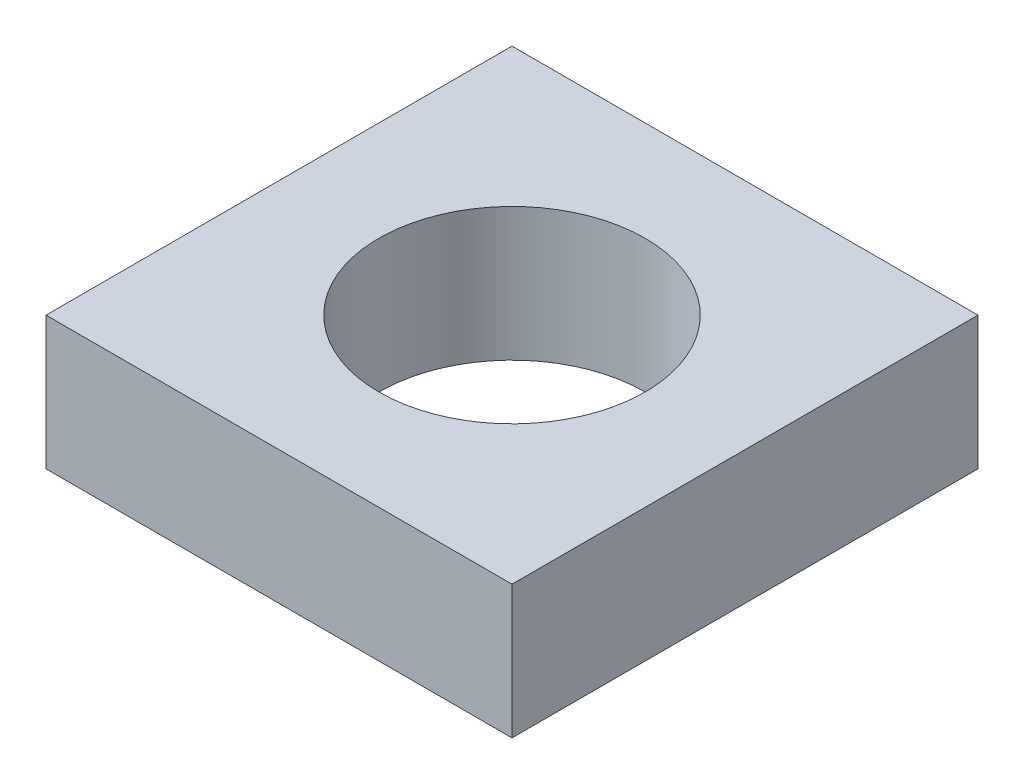
ISO-10303-21;
HEADER;
FILE_DESCRIPTION(('STEP AP214'),'2;1');
FILE_NAME('part.step','',(''),(''),'','','');
FILE_SCHEMA(('AUTOMOTIVE_DESIGN { 1 0 10303 214 1 1 1 1 }'));
ENDSEC;
DATA;
#1=APPLICATION_CONTEXT('core data for automotive mechanical design processes');
#2=APPLICATION_PROTOCOL_DEFINITION('international standard','automotive_design',2000,#1);
#3=PRODUCT_CONTEXT('',#1,'mechanical');
#4=PRODUCT('Part','Part','',(#3));
#5=PRODUCT_RELATED_PRODUCT_CATEGORY('part','',(#4));
#6=PRODUCT_DEFINITION_FORMATION('','',#4);
#7=PRODUCT_DEFINITION_CONTEXT('part definition',#1,'design');
#8=PRODUCT_DEFINITION('design','',#6,#7);
#9=PRODUCT_DEFINITION_SHAPE('','',#8);
#10=(LENGTH_UNIT() NAMED_UNIT(*) SI_UNIT(.MILLI.,.METRE.));
#11=(NAMED_UNIT(*) PLANE_ANGLE_UNIT() SI_UNIT($,.RADIAN.));
#12=(NAMED_UNIT(*) SI_UNIT($,.STERADIAN.) SOLID_ANGLE_UNIT());
#13=UNCERTAINTY_MEASURE_WITH_UNIT(LENGTH_MEASURE(1.E-05),#10,'distance_accuracy_value','');
#14=(GEOMETRIC_REPRESENTATION_CONTEXT(3) GLOBAL_UNCERTAINTY_ASSIGNED_CONTEXT((#13)) GLOBAL_UNIT_ASSIGNED_CONTEXT((#10,
#11,#12)) REPRESENTATION_CONTEXT('',''));
#15=CARTESIAN_POINT('',(0.,0.,0.));
#16=DIRECTION('',(0.,0.,1.));
#17=DIRECTION('',(1.,0.,0.));
#18=AXIS2_PLACEMENT_3D('',#15,#16,#17);
#19=CARTESIAN_POINT('',(0.,2.,0.));
#20=DIRECTION('',(0.,1.,0.));
#21=DIRECTION('',(0.,0.,1.));
#22=AXIS2_PLACEMENT_3D('',#19,#20,#21);
#23=PLANE('',#22);
#24=DIRECTION('',(0.,0.,-1.));
#25=VECTOR('',#24,1.);
#26=CARTESIAN_POINT('',(3.5,2.,-3.5));
#27=LINE('',#26,#25);
#28=CARTESIAN_POINT('',(3.5,2.,3.5));
#29=VERTEX_POINT('',#28);
#30=CARTESIAN_POINT('',(3.5,2.,-3.5));
#31=VERTEX_POINT('',#30);
#32=EDGE_CURVE('E92',#29,#31,#27,.T.);
#33=ORIENTED_EDGE('',*,*,#32,.T.);
#34=DIRECTION('',(-1.,0.,0.));
#35=VECTOR('',#34,1.);
#36=CARTESIAN_POINT('',(-3.5,2.,-3.5));
#37=LINE('',#36,#35);
#38=CARTESIAN_POINT('',(-3.5,2.,-3.5));
#39=VERTEX_POINT('',#38);
#40=EDGE_CURVE('E87',#31,#39,#37,.T.);
#41=ORIENTED_EDGE('',*,*,#40,.T.);
#42=DIRECTION('',(0.,0.,1.));
#43=VECTOR('',#42,1.);
#44=CARTESIAN_POINT('',(-3.5,2.,-3.5));
#45=LINE('',#44,#43);
#46=CARTESIAN_POINT('',(-3.5,2.,3.5));
#47=VERTEX_POINT('',#46);
#48=EDGE_CURVE('E90',#39,#47,#45,.T.);
#49=ORIENTED_EDGE('',*,*,#48,.T.);
#50=DIRECTION('',(1.,0.,0.));
#51=VECTOR('',#50,1.);
#52=CARTESIAN_POINT('',(-3.5,2.,3.5));
#53=LINE('',#52,#51);
#54=EDGE_CURVE('E57',#47,#29,#53,.T.);
#55=ORIENTED_EDGE('',*,*,#54,.T.);
#56=EDGE_LOOP('',(#33,#41,#49,#55));
#57=FACE_BOUND('',#56,.T.);
#58=CARTESIAN_POINT('',(0.,2.,0.));
#59=DIRECTION('',(0.,1.,0.));
#60=DIRECTION('',(0.,0.,1.));
#61=AXIS2_PLACEMENT_3D('',#58,#59,#60);
#62=CIRCLE('',#61,2.);
#63=CARTESIAN_POINT('',(0.,2.,2.));
#64=VERTEX_POINT('',#63);
#65=EDGE_CURVE('E112',#64,#64,#62,.T.);
#66=ORIENTED_EDGE('',*,*,#65,.F.);
#67=EDGE_LOOP('',(#66));
#68=FACE_BOUND('',#67,.T.);
#69=ADVANCED_FACE('F39',(#57,#68),#23,.T.);
#70=CARTESIAN_POINT('',(0.,0.,0.));
#71=DIRECTION('',(0.,1.,0.));
#72=DIRECTION('',(0.,0.,1.));
#73=AXIS2_PLACEMENT_3D('',#70,#71,#72);
#74=PLANE('',#73);
#75=DIRECTION('',(0.,0.,-1.));
#76=VECTOR('',#75,1.);
#77=CARTESIAN_POINT('',(3.5,0.,-3.5));
#78=LINE('',#77,#76);
#79=CARTESIAN_POINT('',(3.5,0.,3.5));
#80=VERTEX_POINT('',#79);
#81=CARTESIAN_POINT('',(3.5,0.,-3.5));
#82=VERTEX_POINT('',#81);
#83=EDGE_CURVE('E108',#80,#82,#78,.T.);
#84=ORIENTED_EDGE('',*,*,#83,.F.);
#85=DIRECTION('',(1.,0.,0.));
#86=VECTOR('',#85,1.);
#87=CARTESIAN_POINT('',(-3.5,0.,3.5));
#88=LINE('',#87,#86);
#89=CARTESIAN_POINT('',(-3.5,0.,3.5));
#90=VERTEX_POINT('',#89);
#91=EDGE_CURVE('E80',#90,#80,#88,.T.);
#92=ORIENTED_EDGE('',*,*,#91,.F.);
#93=DIRECTION('',(0.,0.,1.));
#94=VECTOR('',#93,1.);
#95=CARTESIAN_POINT('',(-3.5,0.,-3.5));
#96=LINE('',#95,#94);
#97=CARTESIAN_POINT('',(-3.5,0.,-3.5));
#98=VERTEX_POINT('',#97);
#99=EDGE_CURVE('E74',#98,#90,#96,.T.);
#100=ORIENTED_EDGE('',*,*,#99,.F.);
#101=DIRECTION('',(-1.,0.,0.));
#102=VECTOR('',#101,1.);
#103=CARTESIAN_POINT('',(-3.5,0.,-3.5));
#104=LINE('',#103,#102);
#105=EDGE_CURVE('E97',#82,#98,#104,.T.);
#106=ORIENTED_EDGE('',*,*,#105,.F.);
#107=EDGE_LOOP('',(#84,#92,#100,#106));
#108=FACE_BOUND('',#107,.T.);
#109=CARTESIAN_POINT('',(0.,0.,0.));
#110=DIRECTION('',(0.,1.,0.));
#111=DIRECTION('',(0.,0.,1.));
#112=AXIS2_PLACEMENT_3D('',#109,#110,#111);
#113=CIRCLE('',#112,2.);
#114=CARTESIAN_POINT('',(0.,0.,2.));
#115=VERTEX_POINT('',#114);
#116=EDGE_CURVE('E130',#115,#115,#113,.T.);
#117=ORIENTED_EDGE('',*,*,#116,.T.);
#118=EDGE_LOOP('',(#117));
#119=FACE_BOUND('',#118,.T.);
#120=ADVANCED_FACE('F125',(#108,#119),#74,.F.);
#121=CARTESIAN_POINT('',(3.5,2.,-3.5));
#122=DIRECTION('',(-1.,0.,0.));
#123=DIRECTION('',(0.,0.,1.));
#124=AXIS2_PLACEMENT_3D('',#121,#122,#123);
#125=PLANE('',#124);
#126=ORIENTED_EDGE('',*,*,#83,.T.);
#127=DIRECTION('',(0.,-1.,0.));
#128=VECTOR('',#127,1.);
#129=CARTESIAN_POINT('',(3.5,2.,-3.5));
#130=LINE('',#129,#128);
#131=EDGE_CURVE('E11',#31,#82,#130,.T.);
#132=ORIENTED_EDGE('',*,*,#131,.F.);
#133=ORIENTED_EDGE('',*,*,#32,.F.);
#134=DIRECTION('',(0.,-1.,0.));
#135=VECTOR('',#134,1.);
#136=CARTESIAN_POINT('',(3.5,2.,3.5));
#137=LINE('',#136,#135);
#138=EDGE_CURVE('E104',#29,#80,#137,.T.);
#139=ORIENTED_EDGE('',*,*,#138,.T.);
#140=EDGE_LOOP('',(#126,#132,#133,#139));
#141=FACE_BOUND('',#140,.T.);
#142=ADVANCED_FACE('F41',(#141),#125,.F.);
#143=CARTESIAN_POINT('',(-3.5,2.,-3.5));
#144=DIRECTION('',(0.,0.,1.));
#145=DIRECTION('',(1.,0.,0.));
#146=AXIS2_PLACEMENT_3D('',#143,#144,#145);
#147=PLANE('',#146);
#148=ORIENTED_EDGE('',*,*,#105,.T.);
#149=DIRECTION('',(0.,-1.,0.));
#150=VECTOR('',#149,1.);
#151=CARTESIAN_POINT('',(-3.5,2.,-3.5));
#152=LINE('',#151,#150);
#153=EDGE_CURVE('E49',#39,#98,#152,.T.);
#154=ORIENTED_EDGE('',*,*,#153,.F.);
#155=ORIENTED_EDGE('',*,*,#40,.F.);
#156=ORIENTED_EDGE('',*,*,#131,.T.);
#157=EDGE_LOOP('',(#148,#154,#155,#156));
#158=FACE_BOUND('',#157,.T.);
#159=ADVANCED_FACE('F96',(#158),#147,.F.);
#160=CARTESIAN_POINT('',(-3.5,2.,-3.5));
#161=DIRECTION('',(1.,0.,0.));
#162=DIRECTION('',(0.,0.,-1.));
#163=AXIS2_PLACEMENT_3D('',#160,#161,#162);
#164=PLANE('',#163);
#165=ORIENTED_EDGE('',*,*,#99,.T.);
#166=DIRECTION('',(0.,-1.,0.));
#167=VECTOR('',#166,1.);
#168=CARTESIAN_POINT('',(-3.5,2.,3.5));
#169=LINE('',#168,#167);
#170=EDGE_CURVE('E99',#47,#90,#169,.T.);
#171=ORIENTED_EDGE('',*,*,#170,.F.);
#172=ORIENTED_EDGE('',*,*,#48,.F.);
#173=ORIENTED_EDGE('',*,*,#153,.T.);
#174=EDGE_LOOP('',(#165,#171,#172,#173));
#175=FACE_BOUND('',#174,.T.);
#176=ADVANCED_FACE('F100',(#175),#164,.F.);
#177=CARTESIAN_POINT('',(-3.5,2.,3.5));
#178=DIRECTION('',(0.,0.,-1.));
#179=DIRECTION('',(-1.,0.,0.));
#180=AXIS2_PLACEMENT_3D('',#177,#178,#179);
#181=PLANE('',#180);
#182=ORIENTED_EDGE('',*,*,#91,.T.);
#183=ORIENTED_EDGE('',*,*,#138,.F.);
#184=ORIENTED_EDGE('',*,*,#54,.F.);
#185=ORIENTED_EDGE('',*,*,#170,.T.);
#186=EDGE_LOOP('',(#182,#183,#184,#185));
#187=FACE_BOUND('',#186,.T.);
#188=ADVANCED_FACE('F122',(#187),#181,.F.);
#189=CARTESIAN_POINT('',(0.,2.,0.));
#190=DIRECTION('',(0.,-1.,0.));
#191=DIRECTION('',(0.,0.,-1.));
#192=AXIS2_PLACEMENT_3D('',#189,#190,#191);
#193=CYLINDRICAL_SURFACE('',#192,2.);
#194=ORIENTED_EDGE('',*,*,#65,.T.);
#195=EDGE_LOOP('',(#194));
#196=FACE_BOUND('',#195,.T.);
#197=ORIENTED_EDGE('',*,*,#116,.F.);
#198=EDGE_LOOP('',(#197));
#199=FACE_BOUND('',#198,.T.);
#200=ADVANCED_FACE('F138',(#196,#199),#193,.F.);
#201=CLOSED_SHELL('',(#69,#120,#142,#159,#176,#188,#200));
#202=MANIFOLD_SOLID_BREP('B2',#201);
#203=ADVANCED_BREP_SHAPE_REPRESENTATION('',(#18,#202),#14);
#204=SHAPE_DEFINITION_REPRESENTATION(#9,#203);
ENDSEC;
END-ISO-10303-21;
